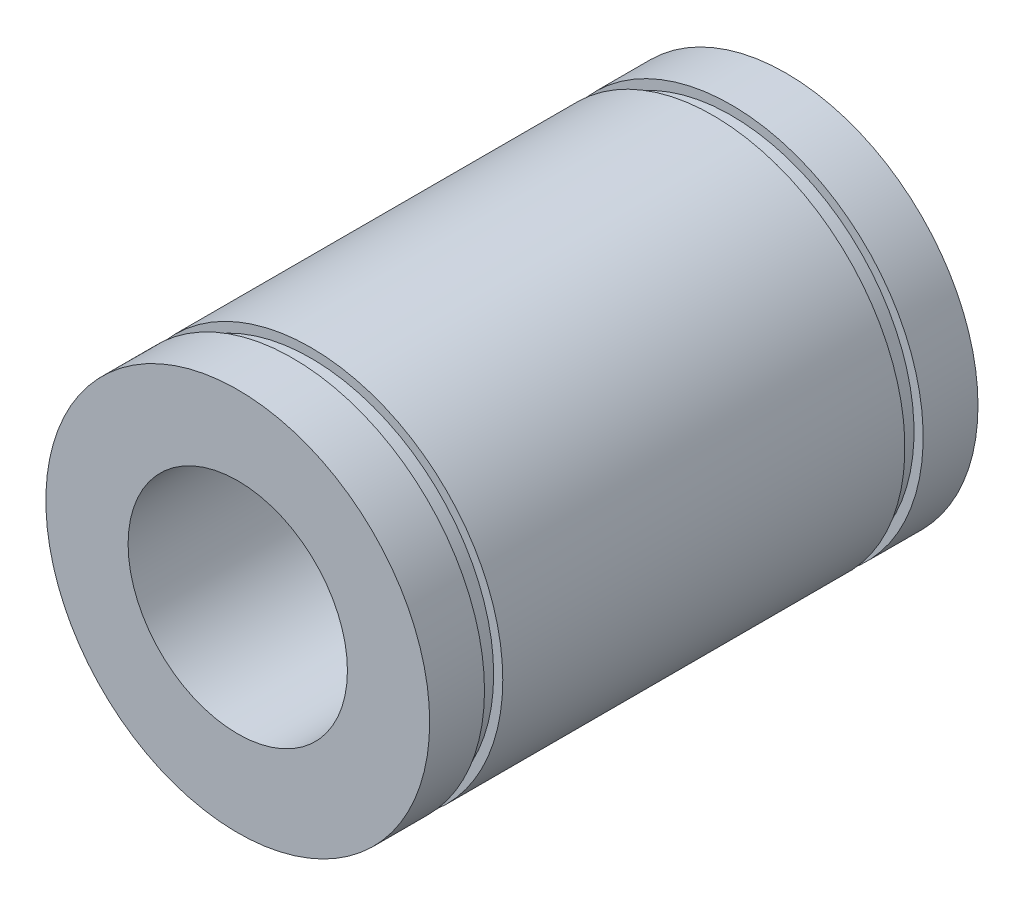
ISO-10303-21;
HEADER;
FILE_DESCRIPTION(('STEP AP214'),'2;1');
FILE_NAME('part.step','',(''),(''),'','','');
FILE_SCHEMA(('AUTOMOTIVE_DESIGN { 1 0 10303 214 1 1 1 1 }'));
ENDSEC;
DATA;
#1=APPLICATION_CONTEXT('core data for automotive mechanical design processes');
#2=APPLICATION_PROTOCOL_DEFINITION('international standard','automotive_design',2000,#1);
#3=PRODUCT_CONTEXT('',#1,'mechanical');
#4=PRODUCT('Part','Part','',(#3));
#5=PRODUCT_RELATED_PRODUCT_CATEGORY('part','',(#4));
#6=PRODUCT_DEFINITION_FORMATION('','',#4);
#7=PRODUCT_DEFINITION_CONTEXT('part definition',#1,'design');
#8=PRODUCT_DEFINITION('design','',#6,#7);
#9=PRODUCT_DEFINITION_SHAPE('','',#8);
#10=(LENGTH_UNIT() NAMED_UNIT(*) SI_UNIT(.MILLI.,.METRE.));
#11=(NAMED_UNIT(*) PLANE_ANGLE_UNIT() SI_UNIT($,.RADIAN.));
#12=(NAMED_UNIT(*) SI_UNIT($,.STERADIAN.) SOLID_ANGLE_UNIT());
#13=UNCERTAINTY_MEASURE_WITH_UNIT(LENGTH_MEASURE(1.E-05),#10,'distance_accuracy_value','');
#14=(GEOMETRIC_REPRESENTATION_CONTEXT(3) GLOBAL_UNCERTAINTY_ASSIGNED_CONTEXT((#13)) GLOBAL_UNIT_ASSIGNED_CONTEXT((#10,
#11,#12)) REPRESENTATION_CONTEXT('',''));
#15=CARTESIAN_POINT('',(0.,0.,0.));
#16=DIRECTION('',(0.,0.,1.));
#17=DIRECTION('',(1.,0.,0.));
#18=AXIS2_PLACEMENT_3D('',#15,#16,#17);
#19=CARTESIAN_POINT('',(0.,0.,30.));
#20=DIRECTION('',(0.,0.,-1.));
#21=DIRECTION('',(-1.,0.,0.));
#22=AXIS2_PLACEMENT_3D('',#19,#20,#21);
#23=CYLINDRICAL_SURFACE('',#22,10.5);
#24=CARTESIAN_POINT('',(0.,0.,4.));
#25=DIRECTION('',(0.,0.,-1.));
#26=DIRECTION('',(-1.,0.,0.));
#27=AXIS2_PLACEMENT_3D('',#24,#25,#26);
#28=CIRCLE('',#27,10.5);
#29=CARTESIAN_POINT('',(-10.5,0.,4.));
#30=VERTEX_POINT('',#29);
#31=EDGE_CURVE('E55',#30,#30,#28,.T.);
#32=ORIENTED_EDGE('',*,*,#31,.F.);
#33=EDGE_LOOP('',(#32));
#34=FACE_BOUND('',#33,.T.);
#35=CARTESIAN_POINT('',(0.,0.,26.));
#36=DIRECTION('',(0.,0.,1.));
#37=DIRECTION('',(1.,0.,0.));
#38=AXIS2_PLACEMENT_3D('',#35,#36,#37);
#39=CIRCLE('',#38,10.5);
#40=CARTESIAN_POINT('',(10.5,0.,26.));
#41=VERTEX_POINT('',#40);
#42=EDGE_CURVE('E67',#41,#41,#39,.T.);
#43=ORIENTED_EDGE('',*,*,#42,.F.);
#44=EDGE_LOOP('',(#43));
#45=FACE_BOUND('',#44,.T.);
#46=ADVANCED_FACE('F39',(#34,#45),#23,.T.);
#47=CARTESIAN_POINT('',(0.,0.,27.));
#48=DIRECTION('',(0.,0.,1.));
#49=DIRECTION('',(1.,0.,0.));
#50=AXIS2_PLACEMENT_3D('',#47,#48,#49);
#51=CIRCLE('',#50,10.5);
#52=CARTESIAN_POINT('',(10.5,0.,27.));
#53=VERTEX_POINT('',#52);
#54=EDGE_CURVE('E70',#53,#53,#51,.T.);
#55=ORIENTED_EDGE('',*,*,#54,.T.);
#56=EDGE_LOOP('',(#55));
#57=FACE_BOUND('',#56,.T.);
#58=CARTESIAN_POINT('',(0.,0.,30.));
#59=DIRECTION('',(0.,0.,1.));
#60=DIRECTION('',(1.,0.,0.));
#61=AXIS2_PLACEMENT_3D('',#58,#59,#60);
#62=CIRCLE('',#61,10.5);
#63=CARTESIAN_POINT('',(10.5,0.,30.));
#64=VERTEX_POINT('',#63);
#65=EDGE_CURVE('E10',#64,#64,#62,.T.);
#66=ORIENTED_EDGE('',*,*,#65,.F.);
#67=EDGE_LOOP('',(#66));
#68=FACE_BOUND('',#67,.T.);
#69=ADVANCED_FACE('F94',(#57,#68),#23,.T.);
#70=CARTESIAN_POINT('',(0.,0.,3.));
#71=DIRECTION('',(0.,0.,-1.));
#72=DIRECTION('',(-1.,0.,0.));
#73=AXIS2_PLACEMENT_3D('',#70,#71,#72);
#74=CIRCLE('',#73,10.5);
#75=CARTESIAN_POINT('',(-10.5,0.,3.));
#76=VERTEX_POINT('',#75);
#77=EDGE_CURVE('E58',#76,#76,#74,.T.);
#78=ORIENTED_EDGE('',*,*,#77,.T.);
#79=EDGE_LOOP('',(#78));
#80=FACE_BOUND('',#79,.T.);
#81=CARTESIAN_POINT('',(0.,0.,0.));
#82=DIRECTION('',(0.,0.,1.));
#83=DIRECTION('',(1.,0.,0.));
#84=AXIS2_PLACEMENT_3D('',#81,#82,#83);
#85=CIRCLE('',#84,10.5);
#86=CARTESIAN_POINT('',(10.5,0.,0.));
#87=VERTEX_POINT('',#86);
#88=EDGE_CURVE('E43',#87,#87,#85,.T.);
#89=ORIENTED_EDGE('',*,*,#88,.T.);
#90=EDGE_LOOP('',(#89));
#91=FACE_BOUND('',#90,.T.);
#92=ADVANCED_FACE('F41',(#80,#91),#23,.T.);
#93=CARTESIAN_POINT('',(0.,0.,30.));
#94=DIRECTION('',(0.,0.,1.));
#95=DIRECTION('',(1.,0.,0.));
#96=AXIS2_PLACEMENT_3D('',#93,#94,#95);
#97=PLANE('',#96);
#98=CARTESIAN_POINT('',(0.,0.18816292376245,30.));
#99=DIRECTION('',(0.,0.,-1.));
#100=DIRECTION('',(-1.,0.,0.));
#101=AXIS2_PLACEMENT_3D('',#98,#99,#100);
#102=CIRCLE('',#101,6.);
#103=CARTESIAN_POINT('',(-6.,0.18816292376245,30.));
#104=VERTEX_POINT('',#103);
#105=EDGE_CURVE('E50',#104,#104,#102,.T.);
#106=ORIENTED_EDGE('',*,*,#105,.T.);
#107=EDGE_LOOP('',(#106));
#108=FACE_BOUND('',#107,.T.);
#109=ORIENTED_EDGE('',*,*,#65,.T.);
#110=EDGE_LOOP('',(#109));
#111=FACE_BOUND('',#110,.T.);
#112=ADVANCED_FACE('F103',(#108,#111),#97,.T.);
#113=CARTESIAN_POINT('',(0.,0.,0.));
#114=DIRECTION('',(0.,0.,1.));
#115=DIRECTION('',(1.,0.,0.));
#116=AXIS2_PLACEMENT_3D('',#113,#114,#115);
#117=PLANE('',#116);
#118=CARTESIAN_POINT('',(0.,0.18816292376245,0.));
#119=DIRECTION('',(0.,0.,-1.));
#120=DIRECTION('',(-1.,0.,0.));
#121=AXIS2_PLACEMENT_3D('',#118,#119,#120);
#122=CIRCLE('',#121,6.);
#123=CARTESIAN_POINT('',(-6.,0.18816292376245,0.));
#124=VERTEX_POINT('',#123);
#125=EDGE_CURVE('E52',#124,#124,#122,.T.);
#126=ORIENTED_EDGE('',*,*,#125,.F.);
#127=EDGE_LOOP('',(#126));
#128=FACE_BOUND('',#127,.T.);
#129=ORIENTED_EDGE('',*,*,#88,.F.);
#130=EDGE_LOOP('',(#129));
#131=FACE_BOUND('',#130,.T.);
#132=ADVANCED_FACE('F110',(#128,#131),#117,.F.);
#133=CARTESIAN_POINT('',(0.,0.18816292376245,30.));
#134=DIRECTION('',(0.,0.,-1.));
#135=DIRECTION('',(-1.,0.,0.));
#136=AXIS2_PLACEMENT_3D('',#133,#134,#135);
#137=CYLINDRICAL_SURFACE('',#136,6.);
#138=ORIENTED_EDGE('',*,*,#105,.F.);
#139=EDGE_LOOP('',(#138));
#140=FACE_BOUND('',#139,.T.);
#141=ORIENTED_EDGE('',*,*,#125,.T.);
#142=EDGE_LOOP('',(#141));
#143=FACE_BOUND('',#142,.T.);
#144=ADVANCED_FACE('F118',(#140,#143),#137,.F.);
#145=CARTESIAN_POINT('',(0.,0.,4.));
#146=DIRECTION('',(0.,0.,-1.));
#147=DIRECTION('',(-1.,0.,0.));
#148=AXIS2_PLACEMENT_3D('',#145,#146,#147);
#149=PLANE('',#148);
#150=CARTESIAN_POINT('',(0.,0.,4.));
#151=DIRECTION('',(0.,0.,-1.));
#152=DIRECTION('',(-1.,0.,0.));
#153=AXIS2_PLACEMENT_3D('',#150,#151,#152);
#154=CIRCLE('',#153,10.);
#155=CARTESIAN_POINT('',(-10.,0.,4.));
#156=VERTEX_POINT('',#155);
#157=EDGE_CURVE('E61',#156,#156,#154,.T.);
#158=ORIENTED_EDGE('',*,*,#157,.F.);
#159=EDGE_LOOP('',(#158));
#160=FACE_BOUND('',#159,.T.);
#161=ORIENTED_EDGE('',*,*,#31,.T.);
#162=EDGE_LOOP('',(#161));
#163=FACE_BOUND('',#162,.T.);
#164=ADVANCED_FACE('F122',(#160,#163),#149,.T.);
#165=CARTESIAN_POINT('',(0.,0.,3.));
#166=DIRECTION('',(0.,0.,-1.));
#167=DIRECTION('',(-1.,0.,0.));
#168=AXIS2_PLACEMENT_3D('',#165,#166,#167);
#169=PLANE('',#168);
#170=CARTESIAN_POINT('',(0.,0.,3.));
#171=DIRECTION('',(0.,0.,-1.));
#172=DIRECTION('',(-1.,0.,0.));
#173=AXIS2_PLACEMENT_3D('',#170,#171,#172);
#174=CIRCLE('',#173,10.);
#175=CARTESIAN_POINT('',(-10.,0.,3.));
#176=VERTEX_POINT('',#175);
#177=EDGE_CURVE('E64',#176,#176,#174,.T.);
#178=ORIENTED_EDGE('',*,*,#177,.T.);
#179=EDGE_LOOP('',(#178));
#180=FACE_BOUND('',#179,.T.);
#181=ORIENTED_EDGE('',*,*,#77,.F.);
#182=EDGE_LOOP('',(#181));
#183=FACE_BOUND('',#182,.T.);
#184=ADVANCED_FACE('F127',(#180,#183),#169,.F.);
#185=CARTESIAN_POINT('',(0.,0.,4.));
#186=DIRECTION('',(0.,0.,-1.));
#187=DIRECTION('',(-1.,0.,0.));
#188=AXIS2_PLACEMENT_3D('',#185,#186,#187);
#189=CYLINDRICAL_SURFACE('',#188,10.);
#190=ORIENTED_EDGE('',*,*,#157,.T.);
#191=EDGE_LOOP('',(#190));
#192=FACE_BOUND('',#191,.T.);
#193=ORIENTED_EDGE('',*,*,#177,.F.);
#194=EDGE_LOOP('',(#193));
#195=FACE_BOUND('',#194,.T.);
#196=ADVANCED_FACE('F89',(#192,#195),#189,.T.);
#197=CARTESIAN_POINT('',(0.,0.,26.));
#198=DIRECTION('',(0.,0.,1.));
#199=DIRECTION('',(1.,0.,0.));
#200=AXIS2_PLACEMENT_3D('',#197,#198,#199);
#201=PLANE('',#200);
#202=CARTESIAN_POINT('',(0.,0.,26.));
#203=DIRECTION('',(0.,0.,1.));
#204=DIRECTION('',(1.,0.,0.));
#205=AXIS2_PLACEMENT_3D('',#202,#203,#204);
#206=CIRCLE('',#205,10.);
#207=CARTESIAN_POINT('',(10.,0.,26.));
#208=VERTEX_POINT('',#207);
#209=EDGE_CURVE('E73',#208,#208,#206,.T.);
#210=ORIENTED_EDGE('',*,*,#209,.F.);
#211=EDGE_LOOP('',(#210));
#212=FACE_BOUND('',#211,.T.);
#213=ORIENTED_EDGE('',*,*,#42,.T.);
#214=EDGE_LOOP('',(#213));
#215=FACE_BOUND('',#214,.T.);
#216=ADVANCED_FACE('F85',(#212,#215),#201,.T.);
#217=CARTESIAN_POINT('',(0.,0.,27.));
#218=DIRECTION('',(0.,0.,1.));
#219=DIRECTION('',(1.,0.,0.));
#220=AXIS2_PLACEMENT_3D('',#217,#218,#219);
#221=PLANE('',#220);
#222=CARTESIAN_POINT('',(0.,0.,27.));
#223=DIRECTION('',(0.,0.,1.));
#224=DIRECTION('',(1.,0.,0.));
#225=AXIS2_PLACEMENT_3D('',#222,#223,#224);
#226=CIRCLE('',#225,10.);
#227=CARTESIAN_POINT('',(10.,0.,27.));
#228=VERTEX_POINT('',#227);
#229=EDGE_CURVE('E76',#228,#228,#226,.T.);
#230=ORIENTED_EDGE('',*,*,#229,.T.);
#231=EDGE_LOOP('',(#230));
#232=FACE_BOUND('',#231,.T.);
#233=ORIENTED_EDGE('',*,*,#54,.F.);
#234=EDGE_LOOP('',(#233));
#235=FACE_BOUND('',#234,.T.);
#236=ADVANCED_FACE('F88',(#232,#235),#221,.F.);
#237=CARTESIAN_POINT('',(0.,0.,26.));
#238=DIRECTION('',(0.,0.,1.));
#239=DIRECTION('',(1.,0.,0.));
#240=AXIS2_PLACEMENT_3D('',#237,#238,#239);
#241=CYLINDRICAL_SURFACE('',#240,10.);
#242=ORIENTED_EDGE('',*,*,#209,.T.);
#243=EDGE_LOOP('',(#242));
#244=FACE_BOUND('',#243,.T.);
#245=ORIENTED_EDGE('',*,*,#229,.F.);
#246=EDGE_LOOP('',(#245));
#247=FACE_BOUND('',#246,.T.);
#248=ADVANCED_FACE('F82',(#244,#247),#241,.T.);
#249=CLOSED_SHELL('',(#46,#69,#92,#112,#132,#144,#164,#184,#196,#216,#236,#248));
#250=MANIFOLD_SOLID_BREP('B2',#249);
#251=ADVANCED_BREP_SHAPE_REPRESENTATION('',(#18,#250),#14);
#252=SHAPE_DEFINITION_REPRESENTATION(#9,#251);
ENDSEC;
END-ISO-10303-21;
